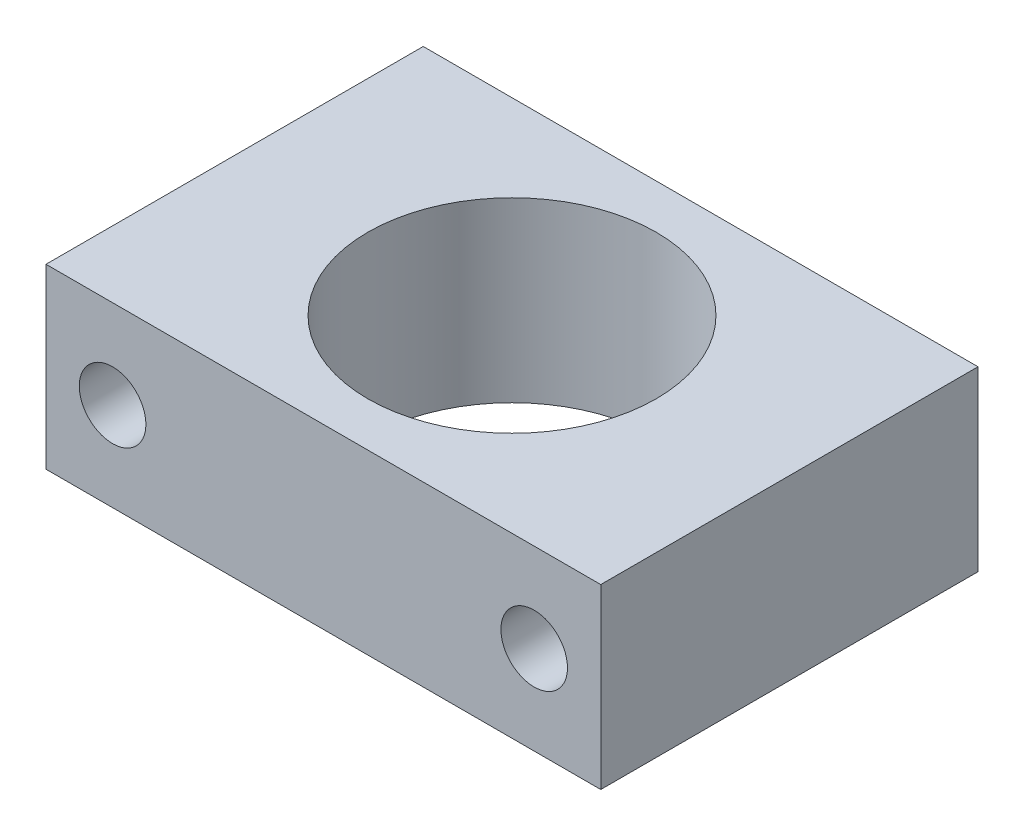
ISO-10303-21;
HEADER;
FILE_DESCRIPTION(('STEP AP214'),'2;1');
FILE_NAME('part.step','',(''),(''),'','','');
FILE_SCHEMA(('AUTOMOTIVE_DESIGN { 1 0 10303 214 1 1 1 1 }'));
ENDSEC;
DATA;
#1=APPLICATION_CONTEXT('core data for automotive mechanical design processes');
#2=APPLICATION_PROTOCOL_DEFINITION('international standard','automotive_design',2000,#1);
#3=PRODUCT_CONTEXT('',#1,'mechanical');
#4=PRODUCT('Part','Part','',(#3));
#5=PRODUCT_RELATED_PRODUCT_CATEGORY('part','',(#4));
#6=PRODUCT_DEFINITION_FORMATION('','',#4);
#7=PRODUCT_DEFINITION_CONTEXT('part definition',#1,'design');
#8=PRODUCT_DEFINITION('design','',#6,#7);
#9=PRODUCT_DEFINITION_SHAPE('','',#8);
#10=(LENGTH_UNIT() NAMED_UNIT(*) SI_UNIT(.MILLI.,.METRE.));
#11=(NAMED_UNIT(*) PLANE_ANGLE_UNIT() SI_UNIT($,.RADIAN.));
#12=(NAMED_UNIT(*) SI_UNIT($,.STERADIAN.) SOLID_ANGLE_UNIT());
#13=UNCERTAINTY_MEASURE_WITH_UNIT(LENGTH_MEASURE(1.E-05),#10,'distance_accuracy_value','');
#14=(GEOMETRIC_REPRESENTATION_CONTEXT(3) GLOBAL_UNCERTAINTY_ASSIGNED_CONTEXT((#13)) GLOBAL_UNIT_ASSIGNED_CONTEXT((#10,
#11,#12)) REPRESENTATION_CONTEXT('',''));
#15=CARTESIAN_POINT('',(0.,0.,0.));
#16=DIRECTION('',(0.,0.,1.));
#17=DIRECTION('',(1.,0.,0.));
#18=AXIS2_PLACEMENT_3D('',#15,#16,#17);
#19=CARTESIAN_POINT('',(0.,4.,0.));
#20=DIRECTION('',(0.,1.,0.));
#21=DIRECTION('',(0.,0.,1.));
#22=AXIS2_PLACEMENT_3D('',#19,#20,#21);
#23=PLANE('',#22);
#24=DIRECTION('',(0.,0.,-1.));
#25=VECTOR('',#24,1.);
#26=CARTESIAN_POINT('',(12.5,4.,-8.5));
#27=LINE('',#26,#25);
#28=CARTESIAN_POINT('',(12.5,4.,8.5));
#29=VERTEX_POINT('',#28);
#30=CARTESIAN_POINT('',(12.5,4.,-8.5));
#31=VERTEX_POINT('',#30);
#32=EDGE_CURVE('E89',#29,#31,#27,.T.);
#33=ORIENTED_EDGE('',*,*,#32,.T.);
#34=DIRECTION('',(-1.,0.,0.));
#35=VECTOR('',#34,1.);
#36=CARTESIAN_POINT('',(-12.5,4.,-8.5));
#37=LINE('',#36,#35);
#38=CARTESIAN_POINT('',(-12.5,4.,-8.5));
#39=VERTEX_POINT('',#38);
#40=EDGE_CURVE('E84',#31,#39,#37,.T.);
#41=ORIENTED_EDGE('',*,*,#40,.T.);
#42=DIRECTION('',(0.,0.,1.));
#43=VECTOR('',#42,1.);
#44=CARTESIAN_POINT('',(-12.5,4.,-8.5));
#45=LINE('',#44,#43);
#46=CARTESIAN_POINT('',(-12.5,4.,8.5));
#47=VERTEX_POINT('',#46);
#48=EDGE_CURVE('E87',#39,#47,#45,.T.);
#49=ORIENTED_EDGE('',*,*,#48,.T.);
#50=DIRECTION('',(1.,0.,0.));
#51=VECTOR('',#50,1.);
#52=CARTESIAN_POINT('',(-12.5,4.,8.5));
#53=LINE('',#52,#51);
#54=EDGE_CURVE('E54',#47,#29,#53,.T.);
#55=ORIENTED_EDGE('',*,*,#54,.T.);
#56=EDGE_LOOP('',(#33,#41,#49,#55));
#57=FACE_BOUND('',#56,.T.);
#58=CARTESIAN_POINT('',(0.,4.,0.));
#59=DIRECTION('',(0.,1.,0.));
#60=DIRECTION('',(0.,0.,1.));
#61=AXIS2_PLACEMENT_3D('',#58,#59,#60);
#62=CIRCLE('',#61,6.5);
#63=CARTESIAN_POINT('',(0.,4.,6.5));
#64=VERTEX_POINT('',#63);
#65=EDGE_CURVE('E104',#64,#64,#62,.T.);
#66=ORIENTED_EDGE('',*,*,#65,.F.);
#67=EDGE_LOOP('',(#66));
#68=FACE_BOUND('',#67,.T.);
#69=ADVANCED_FACE('F37',(#57,#68),#23,.T.);
#70=CARTESIAN_POINT('',(0.,-4.,0.));
#71=DIRECTION('',(0.,1.,0.));
#72=DIRECTION('',(0.,0.,1.));
#73=AXIS2_PLACEMENT_3D('',#70,#71,#72);
#74=PLANE('',#73);
#75=DIRECTION('',(0.,0.,-1.));
#76=VECTOR('',#75,1.);
#77=CARTESIAN_POINT('',(12.5,-4.,-8.5));
#78=LINE('',#77,#76);
#79=CARTESIAN_POINT('',(12.5,-4.,8.5));
#80=VERTEX_POINT('',#79);
#81=CARTESIAN_POINT('',(12.5,-4.,-8.5));
#82=VERTEX_POINT('',#81);
#83=EDGE_CURVE('E101',#80,#82,#78,.T.);
#84=ORIENTED_EDGE('',*,*,#83,.F.);
#85=DIRECTION('',(1.,0.,0.));
#86=VECTOR('',#85,1.);
#87=CARTESIAN_POINT('',(-12.5,-4.,8.5));
#88=LINE('',#87,#86);
#89=CARTESIAN_POINT('',(-12.5,-4.,8.5));
#90=VERTEX_POINT('',#89);
#91=EDGE_CURVE('E77',#90,#80,#88,.T.);
#92=ORIENTED_EDGE('',*,*,#91,.F.);
#93=DIRECTION('',(0.,0.,1.));
#94=VECTOR('',#93,1.);
#95=CARTESIAN_POINT('',(-12.5,-4.,-8.5));
#96=LINE('',#95,#94);
#97=CARTESIAN_POINT('',(-12.5,-4.,-8.5));
#98=VERTEX_POINT('',#97);
#99=EDGE_CURVE('E71',#98,#90,#96,.T.);
#100=ORIENTED_EDGE('',*,*,#99,.F.);
#101=DIRECTION('',(-1.,0.,0.));
#102=VECTOR('',#101,1.);
#103=CARTESIAN_POINT('',(-12.5,-4.,-8.5));
#104=LINE('',#103,#102);
#105=EDGE_CURVE('E93',#82,#98,#104,.T.);
#106=ORIENTED_EDGE('',*,*,#105,.F.);
#107=EDGE_LOOP('',(#84,#92,#100,#106));
#108=FACE_BOUND('',#107,.T.);
#109=CARTESIAN_POINT('',(0.,-4.,0.));
#110=DIRECTION('',(0.,1.,0.));
#111=DIRECTION('',(0.,0.,1.));
#112=AXIS2_PLACEMENT_3D('',#109,#110,#111);
#113=CIRCLE('',#112,6.5);
#114=CARTESIAN_POINT('',(0.,-4.,6.5));
#115=VERTEX_POINT('',#114);
#116=EDGE_CURVE('E116',#115,#115,#113,.T.);
#117=ORIENTED_EDGE('',*,*,#116,.T.);
#118=EDGE_LOOP('',(#117));
#119=FACE_BOUND('',#118,.T.);
#120=ADVANCED_FACE('F112',(#108,#119),#74,.F.);
#121=CARTESIAN_POINT('',(12.5,4.,-8.5));
#122=DIRECTION('',(-1.,0.,0.));
#123=DIRECTION('',(0.,0.,1.));
#124=AXIS2_PLACEMENT_3D('',#121,#122,#123);
#125=PLANE('',#124);
#126=ORIENTED_EDGE('',*,*,#83,.T.);
#127=DIRECTION('',(0.,-1.,0.));
#128=VECTOR('',#127,1.);
#129=CARTESIAN_POINT('',(12.5,4.,-8.5));
#130=LINE('',#129,#128);
#131=EDGE_CURVE('E11',#31,#82,#130,.T.);
#132=ORIENTED_EDGE('',*,*,#131,.F.);
#133=ORIENTED_EDGE('',*,*,#32,.F.);
#134=DIRECTION('',(0.,-1.,0.));
#135=VECTOR('',#134,1.);
#136=CARTESIAN_POINT('',(12.5,4.,8.5));
#137=LINE('',#136,#135);
#138=EDGE_CURVE('E97',#29,#80,#137,.T.);
#139=ORIENTED_EDGE('',*,*,#138,.T.);
#140=EDGE_LOOP('',(#126,#132,#133,#139));
#141=FACE_BOUND('',#140,.T.);
#142=ADVANCED_FACE('F39',(#141),#125,.F.);
#143=CARTESIAN_POINT('',(-12.5,4.,-8.5));
#144=DIRECTION('',(0.,0.,1.));
#145=DIRECTION('',(1.,0.,0.));
#146=AXIS2_PLACEMENT_3D('',#143,#144,#145);
#147=PLANE('',#146);
#148=CARTESIAN_POINT('',(-9.5,0.,-8.5));
#149=DIRECTION('',(0.,0.,-1.));
#150=DIRECTION('',(-1.,0.,0.));
#151=AXIS2_PLACEMENT_3D('',#148,#149,#150);
#152=CIRCLE('',#151,1.5);
#153=CARTESIAN_POINT('',(-11.,0.,-8.5));
#154=VERTEX_POINT('',#153);
#155=EDGE_CURVE('E128',#154,#154,#152,.T.);
#156=ORIENTED_EDGE('',*,*,#155,.F.);
#157=EDGE_LOOP('',(#156));
#158=FACE_BOUND('',#157,.T.);
#159=CARTESIAN_POINT('',(9.5,0.,-8.5));
#160=DIRECTION('',(0.,0.,-1.));
#161=DIRECTION('',(1.,0.,0.));
#162=AXIS2_PLACEMENT_3D('',#159,#160,#161);
#163=CIRCLE('',#162,1.5);
#164=CARTESIAN_POINT('',(11.,0.,-8.5));
#165=VERTEX_POINT('',#164);
#166=EDGE_CURVE('E122',#165,#165,#163,.T.);
#167=ORIENTED_EDGE('',*,*,#166,.F.);
#168=EDGE_LOOP('',(#167));
#169=FACE_BOUND('',#168,.T.);
#170=ORIENTED_EDGE('',*,*,#105,.T.);
#171=DIRECTION('',(0.,-1.,0.));
#172=VECTOR('',#171,1.);
#173=CARTESIAN_POINT('',(-12.5,4.,-8.5));
#174=LINE('',#173,#172);
#175=EDGE_CURVE('E46',#39,#98,#174,.T.);
#176=ORIENTED_EDGE('',*,*,#175,.F.);
#177=ORIENTED_EDGE('',*,*,#40,.F.);
#178=ORIENTED_EDGE('',*,*,#131,.T.);
#179=EDGE_LOOP('',(#170,#176,#177,#178));
#180=FACE_BOUND('',#179,.T.);
#181=ADVANCED_FACE('F92',(#158,#169,#180),#147,.F.);
#182=CARTESIAN_POINT('',(-12.5,4.,-8.5));
#183=DIRECTION('',(1.,0.,0.));
#184=DIRECTION('',(0.,0.,-1.));
#185=AXIS2_PLACEMENT_3D('',#182,#183,#184);
#186=PLANE('',#185);
#187=ORIENTED_EDGE('',*,*,#99,.T.);
#188=DIRECTION('',(0.,-1.,0.));
#189=VECTOR('',#188,1.);
#190=CARTESIAN_POINT('',(-12.5,4.,8.5));
#191=LINE('',#190,#189);
#192=EDGE_CURVE('E94',#47,#90,#191,.T.);
#193=ORIENTED_EDGE('',*,*,#192,.F.);
#194=ORIENTED_EDGE('',*,*,#48,.F.);
#195=ORIENTED_EDGE('',*,*,#175,.T.);
#196=EDGE_LOOP('',(#187,#193,#194,#195));
#197=FACE_BOUND('',#196,.T.);
#198=ADVANCED_FACE('F95',(#197),#186,.F.);
#199=CARTESIAN_POINT('',(-12.5,4.,8.5));
#200=DIRECTION('',(0.,0.,-1.));
#201=DIRECTION('',(-1.,0.,0.));
#202=AXIS2_PLACEMENT_3D('',#199,#200,#201);
#203=PLANE('',#202);
#204=CARTESIAN_POINT('',(-9.5,0.,8.5));
#205=DIRECTION('',(0.,0.,-1.));
#206=DIRECTION('',(-1.,0.,0.));
#207=AXIS2_PLACEMENT_3D('',#204,#205,#206);
#208=CIRCLE('',#207,1.5);
#209=CARTESIAN_POINT('',(-11.,0.,8.5));
#210=VERTEX_POINT('',#209);
#211=EDGE_CURVE('E119',#210,#210,#208,.T.);
#212=ORIENTED_EDGE('',*,*,#211,.T.);
#213=EDGE_LOOP('',(#212));
#214=FACE_BOUND('',#213,.T.);
#215=CARTESIAN_POINT('',(9.5,0.,8.5));
#216=DIRECTION('',(0.,0.,-1.));
#217=DIRECTION('',(1.,0.,0.));
#218=AXIS2_PLACEMENT_3D('',#215,#216,#217);
#219=CIRCLE('',#218,1.5);
#220=CARTESIAN_POINT('',(11.,0.,8.5));
#221=VERTEX_POINT('',#220);
#222=EDGE_CURVE('E125',#221,#221,#219,.T.);
#223=ORIENTED_EDGE('',*,*,#222,.T.);
#224=EDGE_LOOP('',(#223));
#225=FACE_BOUND('',#224,.T.);
#226=ORIENTED_EDGE('',*,*,#91,.T.);
#227=ORIENTED_EDGE('',*,*,#138,.F.);
#228=ORIENTED_EDGE('',*,*,#54,.F.);
#229=ORIENTED_EDGE('',*,*,#192,.T.);
#230=EDGE_LOOP('',(#226,#227,#228,#229));
#231=FACE_BOUND('',#230,.T.);
#232=ADVANCED_FACE('F109',(#214,#225,#231),#203,.F.);
#233=CARTESIAN_POINT('',(0.,4.,0.));
#234=DIRECTION('',(0.,-1.,0.));
#235=DIRECTION('',(0.,0.,-1.));
#236=AXIS2_PLACEMENT_3D('',#233,#234,#235);
#237=CYLINDRICAL_SURFACE('',#236,6.5);
#238=ORIENTED_EDGE('',*,*,#65,.T.);
#239=EDGE_LOOP('',(#238));
#240=FACE_BOUND('',#239,.T.);
#241=ORIENTED_EDGE('',*,*,#116,.F.);
#242=EDGE_LOOP('',(#241));
#243=FACE_BOUND('',#242,.T.);
#244=ADVANCED_FACE('F148',(#240,#243),#237,.F.);
#245=CARTESIAN_POINT('',(9.5,0.,8.5));
#246=DIRECTION('',(0.,0.,-1.));
#247=DIRECTION('',(-1.,0.,0.));
#248=AXIS2_PLACEMENT_3D('',#245,#246,#247);
#249=CYLINDRICAL_SURFACE('',#248,1.5);
#250=ORIENTED_EDGE('',*,*,#222,.F.);
#251=EDGE_LOOP('',(#250));
#252=FACE_BOUND('',#251,.T.);
#253=ORIENTED_EDGE('',*,*,#166,.T.);
#254=EDGE_LOOP('',(#253));
#255=FACE_BOUND('',#254,.T.);
#256=ADVANCED_FACE('F139',(#252,#255),#249,.F.);
#257=CARTESIAN_POINT('',(-9.5,0.,8.5));
#258=DIRECTION('',(0.,0.,-1.));
#259=DIRECTION('',(-1.,0.,0.));
#260=AXIS2_PLACEMENT_3D('',#257,#258,#259);
#261=CYLINDRICAL_SURFACE('',#260,1.5);
#262=ORIENTED_EDGE('',*,*,#211,.F.);
#263=EDGE_LOOP('',(#262));
#264=FACE_BOUND('',#263,.T.);
#265=ORIENTED_EDGE('',*,*,#155,.T.);
#266=EDGE_LOOP('',(#265));
#267=FACE_BOUND('',#266,.T.);
#268=ADVANCED_FACE('F136',(#264,#267),#261,.F.);
#269=CLOSED_SHELL('',(#69,#120,#142,#181,#198,#232,#244,#256,#268));
#270=MANIFOLD_SOLID_BREP('B2',#269);
#271=ADVANCED_BREP_SHAPE_REPRESENTATION('',(#18,#270),#14);
#272=SHAPE_DEFINITION_REPRESENTATION(#9,#271);
ENDSEC;
END-ISO-10303-21;
